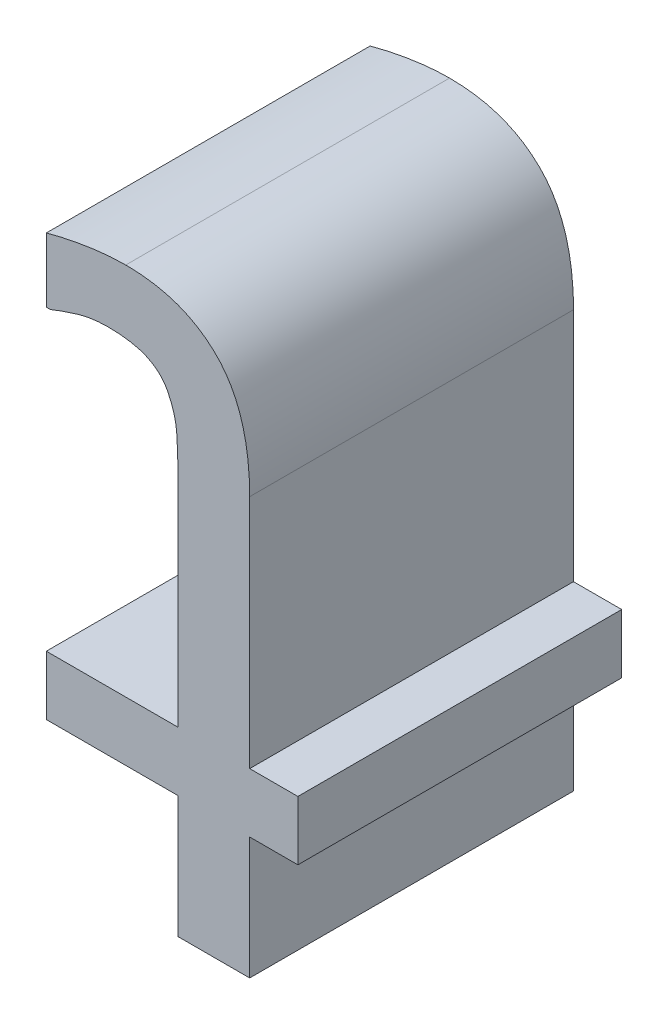
ISO-10303-21;
HEADER;
FILE_DESCRIPTION(('STEP AP214'),'2;1');
FILE_NAME('part.step','',(''),(''),'','','');
FILE_SCHEMA(('AUTOMOTIVE_DESIGN { 1 0 10303 214 1 1 1 1 }'));
ENDSEC;
DATA;
#1=APPLICATION_CONTEXT('core data for automotive mechanical design processes');
#2=APPLICATION_PROTOCOL_DEFINITION('international standard','automotive_design',2000,#1);
#3=PRODUCT_CONTEXT('',#1,'mechanical');
#4=PRODUCT('Part','Part','',(#3));
#5=PRODUCT_RELATED_PRODUCT_CATEGORY('part','',(#4));
#6=PRODUCT_DEFINITION_FORMATION('','',#4);
#7=PRODUCT_DEFINITION_CONTEXT('part definition',#1,'design');
#8=PRODUCT_DEFINITION('design','',#6,#7);
#9=PRODUCT_DEFINITION_SHAPE('','',#8);
#10=(LENGTH_UNIT() NAMED_UNIT(*) SI_UNIT(.MILLI.,.METRE.));
#11=(NAMED_UNIT(*) PLANE_ANGLE_UNIT() SI_UNIT($,.RADIAN.));
#12=(NAMED_UNIT(*) SI_UNIT($,.STERADIAN.) SOLID_ANGLE_UNIT());
#13=UNCERTAINTY_MEASURE_WITH_UNIT(LENGTH_MEASURE(1.E-05),#10,'distance_accuracy_value','');
#14=(GEOMETRIC_REPRESENTATION_CONTEXT(3) GLOBAL_UNCERTAINTY_ASSIGNED_CONTEXT((#13)) GLOBAL_UNIT_ASSIGNED_CONTEXT((#10,
#11,#12)) REPRESENTATION_CONTEXT('',''));
#15=CARTESIAN_POINT('',(0.,0.,0.));
#16=DIRECTION('',(0.,0.,1.));
#17=DIRECTION('',(1.,0.,0.));
#18=AXIS2_PLACEMENT_3D('',#15,#16,#17);
#19=CARTESIAN_POINT('',(5.8393187510365,1.5411365264468,0.));
#20=DIRECTION('',(1.,0.,0.));
#21=DIRECTION('',(0.,1.,0.));
#22=AXIS2_PLACEMENT_3D('',#19,#20,#21);
#23=PLANE('',#22);
#24=DIRECTION('',(0.,-1.,0.));
#25=VECTOR('',#24,1.);
#26=CARTESIAN_POINT('',(5.8393187510365,1.6138711172115,0.));
#27=LINE('',#26,#25);
#28=CARTESIAN_POINT('',(5.8393187510365,1.6138711172115,0.));
#29=VERTEX_POINT('',#28);
#30=CARTESIAN_POINT('',(5.8393187510365,1.5411365264468,0.));
#31=VERTEX_POINT('',#30);
#32=EDGE_CURVE('E11',#29,#31,#27,.T.);
#33=ORIENTED_EDGE('',*,*,#32,.F.);
#34=DIRECTION('',(0.,0.,1.));
#35=VECTOR('',#34,1.);
#36=CARTESIAN_POINT('',(5.8393187510365,1.6138711172115,0.));
#37=LINE('',#36,#35);
#38=CARTESIAN_POINT('',(5.8393187510365,1.6138711172115,0.1));
#39=VERTEX_POINT('',#38);
#40=EDGE_CURVE('E24',#29,#39,#37,.T.);
#41=ORIENTED_EDGE('',*,*,#40,.T.);
#42=DIRECTION('',(0.,1.,0.));
#43=VECTOR('',#42,1.);
#44=CARTESIAN_POINT('',(5.8393187510365,1.6138711172115,0.1));
#45=LINE('',#44,#43);
#46=CARTESIAN_POINT('',(5.8393187510365,1.5411365264468,0.1));
#47=VERTEX_POINT('',#46);
#48=EDGE_CURVE('E160',#47,#39,#45,.T.);
#49=ORIENTED_EDGE('',*,*,#48,.F.);
#50=DIRECTION('',(0.,0.,1.));
#51=VECTOR('',#50,1.);
#52=CARTESIAN_POINT('',(5.8393187510365,1.5411365264468,0.));
#53=LINE('',#52,#51);
#54=EDGE_CURVE('E331',#31,#47,#53,.T.);
#55=ORIENTED_EDGE('',*,*,#54,.F.);
#56=EDGE_LOOP('',(#33,#41,#49,#55));
#57=FACE_BOUND('',#56,.T.);
#58=ADVANCED_FACE('F17',(#57),#23,.T.);
#59=CARTESIAN_POINT('',(5.8542059479766,1.5411365264468,0.));
#60=DIRECTION('',(0.,1.,0.));
#61=DIRECTION('',(-1.,0.,0.));
#62=AXIS2_PLACEMENT_3D('',#59,#60,#61);
#63=PLANE('',#62);
#64=DIRECTION('',(1.,0.,0.));
#65=VECTOR('',#64,1.);
#66=CARTESIAN_POINT('',(5.8393187510365,1.5411365264468,0.));
#67=LINE('',#66,#65);
#68=CARTESIAN_POINT('',(5.8542059479766,1.5411365264468,0.));
#69=VERTEX_POINT('',#68);
#70=EDGE_CURVE('E329',#31,#69,#67,.T.);
#71=ORIENTED_EDGE('',*,*,#70,.F.);
#72=ORIENTED_EDGE('',*,*,#54,.T.);
#73=DIRECTION('',(-1.,0.,0.));
#74=VECTOR('',#73,1.);
#75=CARTESIAN_POINT('',(5.8393187510365,1.5411365264468,0.1));
#76=LINE('',#75,#74);
#77=CARTESIAN_POINT('',(5.8542059479766,1.5411365264468,0.1));
#78=VERTEX_POINT('',#77);
#79=EDGE_CURVE('E327',#78,#47,#76,.T.);
#80=ORIENTED_EDGE('',*,*,#79,.F.);
#81=DIRECTION('',(0.,0.,1.));
#82=VECTOR('',#81,1.);
#83=CARTESIAN_POINT('',(5.8542059479766,1.5411365264468,0.));
#84=LINE('',#83,#82);
#85=EDGE_CURVE('E324',#69,#78,#84,.T.);
#86=ORIENTED_EDGE('',*,*,#85,.F.);
#87=EDGE_LOOP('',(#71,#72,#80,#86));
#88=FACE_BOUND('',#87,.T.);
#89=ADVANCED_FACE('F393',(#88),#63,.T.);
#90=CARTESIAN_POINT('',(5.8542059479766,1.5228465416346,0.));
#91=DIRECTION('',(1.,0.,0.));
#92=DIRECTION('',(0.,1.,0.));
#93=AXIS2_PLACEMENT_3D('',#90,#91,#92);
#94=PLANE('',#93);
#95=DIRECTION('',(0.,-1.,0.));
#96=VECTOR('',#95,1.);
#97=CARTESIAN_POINT('',(5.8542059479766,1.5411365264468,0.));
#98=LINE('',#97,#96);
#99=CARTESIAN_POINT('',(5.8542059479766,1.5228465416346,0.));
#100=VERTEX_POINT('',#99);
#101=EDGE_CURVE('E322',#69,#100,#98,.T.);
#102=ORIENTED_EDGE('',*,*,#101,.F.);
#103=ORIENTED_EDGE('',*,*,#85,.T.);
#104=DIRECTION('',(0.,1.,0.));
#105=VECTOR('',#104,1.);
#106=CARTESIAN_POINT('',(5.8542059479766,1.5411365264468,0.1));
#107=LINE('',#106,#105);
#108=CARTESIAN_POINT('',(5.8542059479766,1.5228465416346,0.1));
#109=VERTEX_POINT('',#108);
#110=EDGE_CURVE('E319',#109,#78,#107,.T.);
#111=ORIENTED_EDGE('',*,*,#110,.F.);
#112=DIRECTION('',(0.,0.,1.));
#113=VECTOR('',#112,1.);
#114=CARTESIAN_POINT('',(5.8542059479766,1.5228465416346,0.));
#115=LINE('',#114,#113);
#116=EDGE_CURVE('E316',#100,#109,#115,.T.);
#117=ORIENTED_EDGE('',*,*,#116,.F.);
#118=EDGE_LOOP('',(#102,#103,#111,#117));
#119=FACE_BOUND('',#118,.T.);
#120=ADVANCED_FACE('F389',(#119),#94,.T.);
#121=CARTESIAN_POINT('',(5.8393187510365,1.5228465416346,0.));
#122=DIRECTION('',(0.,-1.,0.));
#123=DIRECTION('',(1.,0.,0.));
#124=AXIS2_PLACEMENT_3D('',#121,#122,#123);
#125=PLANE('',#124);
#126=DIRECTION('',(-1.,0.,0.));
#127=VECTOR('',#126,1.);
#128=CARTESIAN_POINT('',(5.8542059479766,1.5228465416346,0.));
#129=LINE('',#128,#127);
#130=CARTESIAN_POINT('',(5.8393187510365,1.5228465416346,0.));
#131=VERTEX_POINT('',#130);
#132=EDGE_CURVE('E314',#100,#131,#129,.T.);
#133=ORIENTED_EDGE('',*,*,#132,.F.);
#134=ORIENTED_EDGE('',*,*,#116,.T.);
#135=DIRECTION('',(1.,0.,0.));
#136=VECTOR('',#135,1.);
#137=CARTESIAN_POINT('',(5.8542059479766,1.5228465416346,0.1));
#138=LINE('',#137,#136);
#139=CARTESIAN_POINT('',(5.8393187510365,1.5228465416346,0.1));
#140=VERTEX_POINT('',#139);
#141=EDGE_CURVE('E311',#140,#109,#138,.T.);
#142=ORIENTED_EDGE('',*,*,#141,.F.);
#143=DIRECTION('',(0.,0.,1.));
#144=VECTOR('',#143,1.);
#145=CARTESIAN_POINT('',(5.8393187510365,1.5228465416346,0.));
#146=LINE('',#145,#144);
#147=EDGE_CURVE('E308',#131,#140,#146,.T.);
#148=ORIENTED_EDGE('',*,*,#147,.F.);
#149=EDGE_LOOP('',(#133,#134,#142,#148));
#150=FACE_BOUND('',#149,.T.);
#151=ADVANCED_FACE('F385',(#150),#125,.T.);
#152=CARTESIAN_POINT('',(5.8393187510365,1.4851323093862,0.));
#153=DIRECTION('',(1.,0.,0.));
#154=DIRECTION('',(0.,1.,0.));
#155=AXIS2_PLACEMENT_3D('',#152,#153,#154);
#156=PLANE('',#155);
#157=DIRECTION('',(0.,-1.,0.));
#158=VECTOR('',#157,1.);
#159=CARTESIAN_POINT('',(5.8393187510365,1.5228465416346,0.));
#160=LINE('',#159,#158);
#161=CARTESIAN_POINT('',(5.8393187510365,1.4851323093862,0.));
#162=VERTEX_POINT('',#161);
#163=EDGE_CURVE('E306',#131,#162,#160,.T.);
#164=ORIENTED_EDGE('',*,*,#163,.F.);
#165=ORIENTED_EDGE('',*,*,#147,.T.);
#166=DIRECTION('',(0.,1.,0.));
#167=VECTOR('',#166,1.);
#168=CARTESIAN_POINT('',(5.8393187510365,1.5228465416346,0.1));
#169=LINE('',#168,#167);
#170=CARTESIAN_POINT('',(5.8393187510365,1.4851323093862,0.1));
#171=VERTEX_POINT('',#170);
#172=EDGE_CURVE('E303',#171,#140,#169,.T.);
#173=ORIENTED_EDGE('',*,*,#172,.F.);
#174=DIRECTION('',(0.,0.,1.));
#175=VECTOR('',#174,1.);
#176=CARTESIAN_POINT('',(5.8393187510365,1.4851323093862,0.));
#177=LINE('',#176,#175);
#178=EDGE_CURVE('E300',#162,#171,#177,.T.);
#179=ORIENTED_EDGE('',*,*,#178,.F.);
#180=EDGE_LOOP('',(#164,#165,#173,#179));
#181=FACE_BOUND('',#180,.T.);
#182=ADVANCED_FACE('F381',(#181),#156,.T.);
#183=CARTESIAN_POINT('',(5.8172006298683,1.4851323093862,0.));
#184=DIRECTION('',(0.,-1.,0.));
#185=DIRECTION('',(1.,0.,0.));
#186=AXIS2_PLACEMENT_3D('',#183,#184,#185);
#187=PLANE('',#186);
#188=DIRECTION('',(-1.,0.,0.));
#189=VECTOR('',#188,1.);
#190=CARTESIAN_POINT('',(5.8393187510365,1.4851323093862,0.));
#191=LINE('',#190,#189);
#192=CARTESIAN_POINT('',(5.8172006298683,1.4851323093862,0.));
#193=VERTEX_POINT('',#192);
#194=EDGE_CURVE('E298',#162,#193,#191,.T.);
#195=ORIENTED_EDGE('',*,*,#194,.F.);
#196=ORIENTED_EDGE('',*,*,#178,.T.);
#197=DIRECTION('',(1.,0.,0.));
#198=VECTOR('',#197,1.);
#199=CARTESIAN_POINT('',(5.8393187510365,1.4851323093862,0.1));
#200=LINE('',#199,#198);
#201=CARTESIAN_POINT('',(5.8172006298683,1.4851323093862,0.1));
#202=VERTEX_POINT('',#201);
#203=EDGE_CURVE('E295',#202,#171,#200,.T.);
#204=ORIENTED_EDGE('',*,*,#203,.F.);
#205=DIRECTION('',(0.,0.,1.));
#206=VECTOR('',#205,1.);
#207=CARTESIAN_POINT('',(5.8172006298683,1.4851323093862,0.));
#208=LINE('',#207,#206);
#209=EDGE_CURVE('E292',#193,#202,#208,.T.);
#210=ORIENTED_EDGE('',*,*,#209,.F.);
#211=EDGE_LOOP('',(#195,#196,#204,#210));
#212=FACE_BOUND('',#211,.T.);
#213=ADVANCED_FACE('F377',(#212),#187,.T.);
#214=CARTESIAN_POINT('',(5.8172006298683,1.5228465416346,0.));
#215=DIRECTION('',(-1.,0.,0.));
#216=DIRECTION('',(0.,-1.,0.));
#217=AXIS2_PLACEMENT_3D('',#214,#215,#216);
#218=PLANE('',#217);
#219=DIRECTION('',(0.,1.,0.));
#220=VECTOR('',#219,1.);
#221=CARTESIAN_POINT('',(5.8172006298683,1.4851323093862,0.));
#222=LINE('',#221,#220);
#223=CARTESIAN_POINT('',(5.8172006298683,1.5228465416346,0.));
#224=VERTEX_POINT('',#223);
#225=EDGE_CURVE('E290',#193,#224,#222,.T.);
#226=ORIENTED_EDGE('',*,*,#225,.F.);
#227=ORIENTED_EDGE('',*,*,#209,.T.);
#228=DIRECTION('',(0.,-1.,0.));
#229=VECTOR('',#228,1.);
#230=CARTESIAN_POINT('',(5.8172006298683,1.4851323093862,0.1));
#231=LINE('',#230,#229);
#232=CARTESIAN_POINT('',(5.8172006298683,1.5228465416346,0.1));
#233=VERTEX_POINT('',#232);
#234=EDGE_CURVE('E287',#233,#202,#231,.T.);
#235=ORIENTED_EDGE('',*,*,#234,.F.);
#236=DIRECTION('',(0.,0.,1.));
#237=VECTOR('',#236,1.);
#238=CARTESIAN_POINT('',(5.8172006298683,1.5228465416346,0.));
#239=LINE('',#238,#237);
#240=EDGE_CURVE('E284',#224,#233,#239,.T.);
#241=ORIENTED_EDGE('',*,*,#240,.F.);
#242=EDGE_LOOP('',(#226,#227,#235,#241));
#243=FACE_BOUND('',#242,.T.);
#244=ADVANCED_FACE('F373',(#243),#218,.T.);
#245=CARTESIAN_POINT('',(5.7765089582319,1.5228465416346,0.));
#246=DIRECTION('',(0.,-1.,0.));
#247=DIRECTION('',(1.,0.,0.));
#248=AXIS2_PLACEMENT_3D('',#245,#246,#247);
#249=PLANE('',#248);
#250=DIRECTION('',(-1.,0.,0.));
#251=VECTOR('',#250,1.);
#252=CARTESIAN_POINT('',(5.8172006298683,1.5228465416346,0.));
#253=LINE('',#252,#251);
#254=CARTESIAN_POINT('',(5.7765089582319,1.5228465416346,0.));
#255=VERTEX_POINT('',#254);
#256=EDGE_CURVE('E282',#224,#255,#253,.T.);
#257=ORIENTED_EDGE('',*,*,#256,.F.);
#258=ORIENTED_EDGE('',*,*,#240,.T.);
#259=DIRECTION('',(1.,0.,0.));
#260=VECTOR('',#259,1.);
#261=CARTESIAN_POINT('',(5.8172006298683,1.5228465416346,0.1));
#262=LINE('',#261,#260);
#263=CARTESIAN_POINT('',(5.7765089582319,1.5228465416346,0.1));
#264=VERTEX_POINT('',#263);
#265=EDGE_CURVE('E279',#264,#233,#262,.T.);
#266=ORIENTED_EDGE('',*,*,#265,.F.);
#267=DIRECTION('',(0.,0.,1.));
#268=VECTOR('',#267,1.);
#269=CARTESIAN_POINT('',(5.7765089582319,1.5228465416346,0.));
#270=LINE('',#269,#268);
#271=EDGE_CURVE('E276',#255,#264,#270,.T.);
#272=ORIENTED_EDGE('',*,*,#271,.F.);
#273=EDGE_LOOP('',(#257,#258,#266,#272));
#274=FACE_BOUND('',#273,.T.);
#275=ADVANCED_FACE('F369',(#274),#249,.T.);
#276=CARTESIAN_POINT('',(5.7765089582319,1.5411365264468,0.));
#277=DIRECTION('',(-1.,0.,0.));
#278=DIRECTION('',(0.,-1.,0.));
#279=AXIS2_PLACEMENT_3D('',#276,#277,#278);
#280=PLANE('',#279);
#281=DIRECTION('',(0.,1.,0.));
#282=VECTOR('',#281,1.);
#283=CARTESIAN_POINT('',(5.7765089582319,1.5228465416346,0.));
#284=LINE('',#283,#282);
#285=CARTESIAN_POINT('',(5.7765089582319,1.5411365264468,0.));
#286=VERTEX_POINT('',#285);
#287=EDGE_CURVE('E274',#255,#286,#284,.T.);
#288=ORIENTED_EDGE('',*,*,#287,.F.);
#289=ORIENTED_EDGE('',*,*,#271,.T.);
#290=DIRECTION('',(0.,-1.,0.));
#291=VECTOR('',#290,1.);
#292=CARTESIAN_POINT('',(5.7765089582319,1.5228465416346,0.1));
#293=LINE('',#292,#291);
#294=CARTESIAN_POINT('',(5.7765089582319,1.5411365264468,0.1));
#295=VERTEX_POINT('',#294);
#296=EDGE_CURVE('E271',#295,#264,#293,.T.);
#297=ORIENTED_EDGE('',*,*,#296,.F.);
#298=DIRECTION('',(0.,0.,1.));
#299=VECTOR('',#298,1.);
#300=CARTESIAN_POINT('',(5.7765089582319,1.5411365264468,0.));
#301=LINE('',#300,#299);
#302=EDGE_CURVE('E268',#286,#295,#301,.T.);
#303=ORIENTED_EDGE('',*,*,#302,.F.);
#304=EDGE_LOOP('',(#288,#289,#297,#303));
#305=FACE_BOUND('',#304,.T.);
#306=ADVANCED_FACE('F365',(#305),#280,.T.);
#307=CARTESIAN_POINT('',(5.8172006298683,1.5411365264468,0.));
#308=DIRECTION('',(0.,1.,0.));
#309=DIRECTION('',(-1.,0.,0.));
#310=AXIS2_PLACEMENT_3D('',#307,#308,#309);
#311=PLANE('',#310);
#312=DIRECTION('',(1.,0.,0.));
#313=VECTOR('',#312,1.);
#314=CARTESIAN_POINT('',(5.7765089582319,1.5411365264468,0.));
#315=LINE('',#314,#313);
#316=CARTESIAN_POINT('',(5.8172006298683,1.5411365264468,0.));
#317=VERTEX_POINT('',#316);
#318=EDGE_CURVE('E266',#286,#317,#315,.T.);
#319=ORIENTED_EDGE('',*,*,#318,.F.);
#320=ORIENTED_EDGE('',*,*,#302,.T.);
#321=DIRECTION('',(-1.,0.,0.));
#322=VECTOR('',#321,1.);
#323=CARTESIAN_POINT('',(5.7765089582319,1.5411365264468,0.1));
#324=LINE('',#323,#322);
#325=CARTESIAN_POINT('',(5.8172006298683,1.5411365264468,0.1));
#326=VERTEX_POINT('',#325);
#327=EDGE_CURVE('E263',#326,#295,#324,.T.);
#328=ORIENTED_EDGE('',*,*,#327,.F.);
#329=DIRECTION('',(0.,0.,1.));
#330=VECTOR('',#329,1.);
#331=CARTESIAN_POINT('',(5.8172006298683,1.5411365264468,0.));
#332=LINE('',#331,#330);
#333=EDGE_CURVE('E260',#317,#326,#332,.T.);
#334=ORIENTED_EDGE('',*,*,#333,.F.);
#335=EDGE_LOOP('',(#319,#320,#328,#334));
#336=FACE_BOUND('',#335,.T.);
#337=ADVANCED_FACE('F361',(#336),#311,.T.);
#338=CARTESIAN_POINT('',(5.8172006298683,1.6036627535954,0.));
#339=DIRECTION('',(-1.,0.,0.));
#340=DIRECTION('',(0.,-1.,0.));
#341=AXIS2_PLACEMENT_3D('',#338,#339,#340);
#342=PLANE('',#341);
#343=DIRECTION('',(0.,1.,0.));
#344=VECTOR('',#343,1.);
#345=CARTESIAN_POINT('',(5.8172006298683,1.5411365264468,0.));
#346=LINE('',#345,#344);
#347=CARTESIAN_POINT('',(5.8172006298683,1.6036627535954,0.));
#348=VERTEX_POINT('',#347);
#349=EDGE_CURVE('E258',#317,#348,#346,.T.);
#350=ORIENTED_EDGE('',*,*,#349,.F.);
#351=ORIENTED_EDGE('',*,*,#333,.T.);
#352=DIRECTION('',(0.,-1.,0.));
#353=VECTOR('',#352,1.);
#354=CARTESIAN_POINT('',(5.8172006298683,1.5411365264468,0.1));
#355=LINE('',#354,#353);
#356=CARTESIAN_POINT('',(5.8172006298683,1.6036627535954,0.1));
#357=VERTEX_POINT('',#356);
#358=EDGE_CURVE('E255',#357,#326,#355,.T.);
#359=ORIENTED_EDGE('',*,*,#358,.F.);
#360=DIRECTION('',(0.,0.,1.));
#361=VECTOR('',#360,1.);
#362=CARTESIAN_POINT('',(5.8172006298683,1.6036627535954,0.));
#363=LINE('',#362,#361);
#364=EDGE_CURVE('E249',#348,#357,#363,.T.);
#365=ORIENTED_EDGE('',*,*,#364,.F.);
#366=EDGE_LOOP('',(#350,#351,#359,#365));
#367=FACE_BOUND('',#366,.T.);
#368=ADVANCED_FACE('F357',(#367),#342,.T.);
#369=CARTESIAN_POINT('',(5.8140814076522,1.6291836626356,0.));
#370=CARTESIAN_POINT('',(5.8140814076522,1.6291836626356,0.1));
#371=CARTESIAN_POINT('',(5.8164917157283,1.6245048293116,0.));
#372=CARTESIAN_POINT('',(5.8164917157283,1.6245048293116,0.1));
#373=CARTESIAN_POINT('',(5.8172006298683,1.6135875515555,0.));
#374=CARTESIAN_POINT('',(5.8172006298683,1.6135875515555,0.1));
#375=CARTESIAN_POINT('',(5.8172006298683,1.6036627535954,0.));
#376=CARTESIAN_POINT('',(5.8172006298683,1.6036627535954,0.1));
#377=B_SPLINE_SURFACE_WITH_KNOTS('',2,1,((#369,#370),(#371,#372),(#373,#374),(#375,#376)),
.UNSPECIFIED.,.F.,.F.,.F.,(3,1,3),(2,2),(-2.,-1.,0.),(0.,0.01),.UNSPECIFIED.);
#378=CARTESIAN_POINT('',(5.8172006298683,1.6036627535954,0.));
#379=CARTESIAN_POINT('',(5.8172006298683,1.6135875515555,0.));
#380=CARTESIAN_POINT('',(5.8164917157283,1.6245048293116,0.));
#381=CARTESIAN_POINT('',(5.8140814076522,1.6291836626356,0.));
#382=B_SPLINE_CURVE_WITH_KNOTS('',2,(#378,#379,#380,#381),.UNSPECIFIED.,.F.,.F.,(3,1,3),(0.,1.,
2.),.UNSPECIFIED.);
#383=CARTESIAN_POINT('',(5.8140814076522,1.6291836626356,0.));
#384=VERTEX_POINT('',#383);
#385=EDGE_CURVE('E242',#348,#384,#382,.T.);
#386=CARTESIAN_POINT('',(5.8140814076522,1.6291836626356,0.1));
#387=CARTESIAN_POINT('',(5.8164917157283,1.6245048293116,0.1));
#388=CARTESIAN_POINT('',(5.8172006298683,1.6135875515555,0.1));
#389=CARTESIAN_POINT('',(5.8172006298683,1.6036627535954,0.1));
#390=B_SPLINE_CURVE_WITH_KNOTS('',2,(#386,#387,#388,#389),.UNSPECIFIED.,.F.,.F.,(3,1,3),(-2.,
-1.,0.),.UNSPECIFIED.);
#391=CARTESIAN_POINT('',(5.8140814076522,1.6291836626356,0.1));
#392=VERTEX_POINT('',#391);
#393=EDGE_CURVE('E237',#392,#357,#390,.T.);
#394=DIRECTION('',(0.,0.,1.));
#395=VECTOR('',#394,1.);
#396=CARTESIAN_POINT('',(5.8140814076522,1.6291836626356,0.));
#397=LINE('',#396,#395);
#398=EDGE_CURVE('E231',#384,#392,#397,.T.);
#399=ORIENTED_EDGE('',*,*,#385,.F.);
#400=ORIENTED_EDGE('',*,*,#364,.T.);
#401=ORIENTED_EDGE('',*,*,#393,.F.);
#402=ORIENTED_EDGE('',*,*,#398,.F.);
#403=EDGE_LOOP('',(#399,#400,#401,#402));
#404=FACE_BOUND('',#403,.T.);
#405=ADVANCED_FACE('F353',(#404),#377,.T.);
#406=CARTESIAN_POINT('',(5.7955078571841,1.6374070666597,0.));
#407=CARTESIAN_POINT('',(5.7955078571841,1.6374070666597,0.1));
#408=CARTESIAN_POINT('',(5.8031641298961,1.6374070666597,0.));
#409=CARTESIAN_POINT('',(5.8031641298961,1.6374070666597,0.1));
#410=CARTESIAN_POINT('',(5.8120964480602,1.6332953646477,0.));
#411=CARTESIAN_POINT('',(5.8120964480602,1.6332953646477,0.1));
#412=CARTESIAN_POINT('',(5.8140814076522,1.6291836626356,0.));
#413=CARTESIAN_POINT('',(5.8140814076522,1.6291836626356,0.1));
#414=B_SPLINE_SURFACE_WITH_KNOTS('',2,1,((#406,#407),(#408,#409),(#410,#411),(#412,#413)),
.UNSPECIFIED.,.F.,.F.,.F.,(3,1,3),(2,2),(-2.,-1.,0.),(0.,0.01),.UNSPECIFIED.);
#415=CARTESIAN_POINT('',(5.8140814076522,1.6291836626356,0.));
#416=CARTESIAN_POINT('',(5.8120964480602,1.6332953646477,0.));
#417=CARTESIAN_POINT('',(5.8031641298961,1.6374070666597,0.));
#418=CARTESIAN_POINT('',(5.7955078571841,1.6374070666597,0.));
#419=B_SPLINE_CURVE_WITH_KNOTS('',2,(#415,#416,#417,#418),.UNSPECIFIED.,.F.,.F.,(3,1,3),(0.,1.,
2.),.UNSPECIFIED.);
#420=CARTESIAN_POINT('',(5.7955078571841,1.6374070666597,0.));
#421=VERTEX_POINT('',#420);
#422=EDGE_CURVE('E224',#384,#421,#419,.T.);
#423=CARTESIAN_POINT('',(5.7955078571841,1.6374070666597,0.1));
#424=CARTESIAN_POINT('',(5.8031641298961,1.6374070666597,0.1));
#425=CARTESIAN_POINT('',(5.8120964480602,1.6332953646477,0.1));
#426=CARTESIAN_POINT('',(5.8140814076522,1.6291836626356,0.1));
#427=B_SPLINE_CURVE_WITH_KNOTS('',2,(#423,#424,#425,#426),.UNSPECIFIED.,.F.,.F.,(3,1,3),(-2.,
-1.,0.),.UNSPECIFIED.);
#428=CARTESIAN_POINT('',(5.7955078571841,1.6374070666597,0.1));
#429=VERTEX_POINT('',#428);
#430=EDGE_CURVE('E219',#429,#392,#427,.T.);
#431=DIRECTION('',(0.,0.,1.));
#432=VECTOR('',#431,1.);
#433=CARTESIAN_POINT('',(5.7955078571841,1.6374070666597,0.));
#434=LINE('',#433,#432);
#435=EDGE_CURVE('E213',#421,#429,#434,.T.);
#436=ORIENTED_EDGE('',*,*,#422,.F.);
#437=ORIENTED_EDGE('',*,*,#398,.T.);
#438=ORIENTED_EDGE('',*,*,#430,.F.);
#439=ORIENTED_EDGE('',*,*,#435,.F.);
#440=EDGE_LOOP('',(#436,#437,#438,#439));
#441=FACE_BOUND('',#440,.T.);
#442=ADVANCED_FACE('F349',(#441),#414,.T.);
#443=CARTESIAN_POINT('',(5.7777850036839,1.6331535818197,0.));
#444=CARTESIAN_POINT('',(5.7777850036839,1.6331535818197,0.1));
#445=CARTESIAN_POINT('',(5.7800535289319,1.6341460616157,0.));
#446=CARTESIAN_POINT('',(5.7800535289319,1.6341460616157,0.1));
#447=CARTESIAN_POINT('',(5.79012010972,1.6374070666597,0.));
#448=CARTESIAN_POINT('',(5.79012010972,1.6374070666597,0.1));
#449=CARTESIAN_POINT('',(5.7955078571841,1.6374070666597,0.));
#450=CARTESIAN_POINT('',(5.7955078571841,1.6374070666597,0.1));
#451=B_SPLINE_SURFACE_WITH_KNOTS('',2,1,((#443,#444),(#445,#446),(#447,#448),(#449,#450)),
.UNSPECIFIED.,.F.,.F.,.F.,(3,1,3),(2,2),(-2.,-1.,0.),(0.,0.01),.UNSPECIFIED.);
#452=CARTESIAN_POINT('',(5.7955078571841,1.6374070666597,0.));
#453=CARTESIAN_POINT('',(5.79012010972,1.6374070666597,0.));
#454=CARTESIAN_POINT('',(5.7800535289319,1.6341460616157,0.));
#455=CARTESIAN_POINT('',(5.7777850036839,1.6331535818197,0.));
#456=B_SPLINE_CURVE_WITH_KNOTS('',2,(#452,#453,#454,#455),.UNSPECIFIED.,.F.,.F.,(3,1,3),(0.,1.,
2.),.UNSPECIFIED.);
#457=CARTESIAN_POINT('',(5.7777850036839,1.6331535818197,0.));
#458=VERTEX_POINT('',#457);
#459=EDGE_CURVE('E206',#421,#458,#456,.T.);
#460=CARTESIAN_POINT('',(5.7777850036839,1.6331535818197,0.1));
#461=CARTESIAN_POINT('',(5.7800535289319,1.6341460616157,0.1));
#462=CARTESIAN_POINT('',(5.79012010972,1.6374070666597,0.1));
#463=CARTESIAN_POINT('',(5.7955078571841,1.6374070666597,0.1));
#464=B_SPLINE_CURVE_WITH_KNOTS('',2,(#460,#461,#462,#463),.UNSPECIFIED.,.F.,.F.,(3,1,3),(-2.,
-1.,0.),.UNSPECIFIED.);
#465=CARTESIAN_POINT('',(5.7777850036839,1.6331535818197,0.1));
#466=VERTEX_POINT('',#465);
#467=EDGE_CURVE('E201',#466,#429,#464,.T.);
#468=DIRECTION('',(0.,0.,1.));
#469=VECTOR('',#468,1.);
#470=CARTESIAN_POINT('',(5.7777850036839,1.6331535818197,0.));
#471=LINE('',#470,#469);
#472=EDGE_CURVE('E198',#458,#466,#471,.T.);
#473=ORIENTED_EDGE('',*,*,#459,.F.);
#474=ORIENTED_EDGE('',*,*,#435,.T.);
#475=ORIENTED_EDGE('',*,*,#467,.F.);
#476=ORIENTED_EDGE('',*,*,#472,.F.);
#477=EDGE_LOOP('',(#473,#474,#475,#476));
#478=FACE_BOUND('',#477,.T.);
#479=ADVANCED_FACE('F345',(#478),#451,.T.);
#480=CARTESIAN_POINT('',(5.7765089582319,1.6331535818197,0.));
#481=DIRECTION('',(0.,-1.,0.));
#482=DIRECTION('',(1.,0.,0.));
#483=AXIS2_PLACEMENT_3D('',#480,#481,#482);
#484=PLANE('',#483);
#485=DIRECTION('',(-1.,0.,0.));
#486=VECTOR('',#485,1.);
#487=CARTESIAN_POINT('',(5.7777850036839,1.6331535818197,0.));
#488=LINE('',#487,#486);
#489=CARTESIAN_POINT('',(5.7765089582319,1.6331535818197,0.));
#490=VERTEX_POINT('',#489);
#491=EDGE_CURVE('E196',#458,#490,#488,.T.);
#492=ORIENTED_EDGE('',*,*,#491,.F.);
#493=ORIENTED_EDGE('',*,*,#472,.T.);
#494=DIRECTION('',(1.,0.,0.));
#495=VECTOR('',#494,1.);
#496=CARTESIAN_POINT('',(5.7777850036839,1.6331535818197,0.1));
#497=LINE('',#496,#495);
#498=CARTESIAN_POINT('',(5.7765089582319,1.6331535818197,0.1));
#499=VERTEX_POINT('',#498);
#500=EDGE_CURVE('E193',#499,#466,#497,.T.);
#501=ORIENTED_EDGE('',*,*,#500,.F.);
#502=DIRECTION('',(0.,0.,1.));
#503=VECTOR('',#502,1.);
#504=CARTESIAN_POINT('',(5.7765089582319,1.6331535818197,0.));
#505=LINE('',#504,#503);
#506=EDGE_CURVE('E190',#490,#499,#505,.T.);
#507=ORIENTED_EDGE('',*,*,#506,.F.);
#508=EDGE_LOOP('',(#492,#493,#501,#507));
#509=FACE_BOUND('',#508,.T.);
#510=ADVANCED_FACE('F341',(#509),#484,.T.);
#511=CARTESIAN_POINT('',(5.7765089582319,1.6530031777399,0.));
#512=DIRECTION('',(-1.,0.,0.));
#513=DIRECTION('',(0.,-1.,0.));
#514=AXIS2_PLACEMENT_3D('',#511,#512,#513);
#515=PLANE('',#514);
#516=DIRECTION('',(0.,1.,0.));
#517=VECTOR('',#516,1.);
#518=CARTESIAN_POINT('',(5.7765089582319,1.6331535818197,0.));
#519=LINE('',#518,#517);
#520=CARTESIAN_POINT('',(5.7765089582319,1.6530031777399,0.));
#521=VERTEX_POINT('',#520);
#522=EDGE_CURVE('E188',#490,#521,#519,.T.);
#523=ORIENTED_EDGE('',*,*,#522,.F.);
#524=ORIENTED_EDGE('',*,*,#506,.T.);
#525=DIRECTION('',(0.,-1.,0.));
#526=VECTOR('',#525,1.);
#527=CARTESIAN_POINT('',(5.7765089582319,1.6331535818197,0.1));
#528=LINE('',#527,#526);
#529=CARTESIAN_POINT('',(5.7765089582319,1.6530031777399,0.1));
#530=VERTEX_POINT('',#529);
#531=EDGE_CURVE('E186',#530,#499,#528,.T.);
#532=ORIENTED_EDGE('',*,*,#531,.F.);
#533=DIRECTION('',(0.,0.,1.));
#534=VECTOR('',#533,1.);
#535=CARTESIAN_POINT('',(5.7765089582319,1.6530031777399,0.));
#536=LINE('',#535,#534);
#537=EDGE_CURVE('E145',#521,#530,#536,.T.);
#538=ORIENTED_EDGE('',*,*,#537,.F.);
#539=EDGE_LOOP('',(#523,#524,#532,#538));
#540=FACE_BOUND('',#539,.T.);
#541=ADVANCED_FACE('F339',(#540),#515,.T.);
#542=CARTESIAN_POINT('',(5.8010373874761,1.6566895312679,0.));
#543=CARTESIAN_POINT('',(5.8010373874761,1.6566895312679,0.1));
#544=CARTESIAN_POINT('',(5.7955078571841,1.6566895312679,0.));
#545=CARTESIAN_POINT('',(5.7955078571841,1.6566895312679,0.1));
#546=CARTESIAN_POINT('',(5.7827474026639,1.6547045716759,0.));
#547=CARTESIAN_POINT('',(5.7827474026639,1.6547045716759,0.1));
#548=CARTESIAN_POINT('',(5.7765089582319,1.6530031777399,0.));
#549=CARTESIAN_POINT('',(5.7765089582319,1.6530031777399,0.1));
#550=B_SPLINE_SURFACE_WITH_KNOTS('',2,1,((#542,#543),(#544,#545),(#546,#547),(#548,#549)),
.UNSPECIFIED.,.F.,.F.,.F.,(3,1,3),(2,2),(-2.,-1.,0.),(0.,0.01),.UNSPECIFIED.);
#551=CARTESIAN_POINT('',(5.7765089582319,1.6530031777399,0.));
#552=CARTESIAN_POINT('',(5.7827474026639,1.6547045716759,0.));
#553=CARTESIAN_POINT('',(5.7955078571841,1.6566895312679,0.));
#554=CARTESIAN_POINT('',(5.8010373874761,1.6566895312679,0.));
#555=B_SPLINE_CURVE_WITH_KNOTS('',2,(#551,#552,#553,#554),.UNSPECIFIED.,.F.,.F.,(3,1,3),(0.,1.,
2.),.UNSPECIFIED.);
#556=CARTESIAN_POINT('',(5.8010373874761,1.6566895312679,0.));
#557=VERTEX_POINT('',#556);
#558=EDGE_CURVE('E149',#521,#557,#555,.T.);
#559=CARTESIAN_POINT('',(5.8010373874761,1.6566895312679,0.1));
#560=CARTESIAN_POINT('',(5.7955078571841,1.6566895312679,0.1));
#561=CARTESIAN_POINT('',(5.7827474026639,1.6547045716759,0.1));
#562=CARTESIAN_POINT('',(5.7765089582319,1.6530031777399,0.1));
#563=B_SPLINE_CURVE_WITH_KNOTS('',2,(#559,#560,#561,#562),.UNSPECIFIED.,.F.,.F.,(3,1,3),(-2.,
-1.,0.),.UNSPECIFIED.);
#564=CARTESIAN_POINT('',(5.8010373874761,1.6566895312679,0.1));
#565=VERTEX_POINT('',#564);
#566=EDGE_CURVE('E138',#565,#530,#563,.T.);
#567=DIRECTION('',(0.,0.,1.));
#568=VECTOR('',#567,1.);
#569=CARTESIAN_POINT('',(5.8010373874761,1.6566895312679,0.));
#570=LINE('',#569,#568);
#571=EDGE_CURVE('E142',#557,#565,#570,.T.);
#572=ORIENTED_EDGE('',*,*,#558,.F.);
#573=ORIENTED_EDGE('',*,*,#537,.T.);
#574=ORIENTED_EDGE('',*,*,#566,.F.);
#575=ORIENTED_EDGE('',*,*,#571,.F.);
#576=EDGE_LOOP('',(#572,#573,#574,#575));
#577=FACE_BOUND('',#576,.T.);
#578=ADVANCED_FACE('F141',(#577),#550,.T.);
#579=CARTESIAN_POINT('',(5.8393187510365,1.6138711172115,0.));
#580=CARTESIAN_POINT('',(5.8393187510365,1.6138711172115,0.1));
#581=CARTESIAN_POINT('',(5.8393187510365,1.6361310212077,0.));
#582=CARTESIAN_POINT('',(5.8393187510365,1.6361310212077,0.1));
#583=CARTESIAN_POINT('',(5.8190438066323,1.6566895312679,0.));
#584=CARTESIAN_POINT('',(5.8190438066323,1.6566895312679,0.1));
#585=CARTESIAN_POINT('',(5.8010373874761,1.6566895312679,0.));
#586=CARTESIAN_POINT('',(5.8010373874761,1.6566895312679,0.1));
#587=B_SPLINE_SURFACE_WITH_KNOTS('',2,1,((#579,#580),(#581,#582),(#583,#584),(#585,#586)),
.UNSPECIFIED.,.F.,.F.,.F.,(3,1,3),(2,2),(-2.,-1.,0.),(0.,0.01),.UNSPECIFIED.);
#588=CARTESIAN_POINT('',(5.8010373874761,1.6566895312679,0.));
#589=CARTESIAN_POINT('',(5.8190438066323,1.6566895312679,0.));
#590=CARTESIAN_POINT('',(5.8393187510365,1.6361310212077,0.));
#591=CARTESIAN_POINT('',(5.8393187510365,1.6138711172115,0.));
#592=B_SPLINE_CURVE_WITH_KNOTS('',2,(#588,#589,#590,#591),.UNSPECIFIED.,.F.,.F.,(3,1,3),(0.,1.,
2.),.UNSPECIFIED.);
#593=EDGE_CURVE('E155',#557,#29,#592,.T.);
#594=CARTESIAN_POINT('',(5.8393187510365,1.6138711172115,0.1));
#595=CARTESIAN_POINT('',(5.8393187510365,1.6361310212077,0.1));
#596=CARTESIAN_POINT('',(5.8190438066323,1.6566895312679,0.1));
#597=CARTESIAN_POINT('',(5.8010373874761,1.6566895312679,0.1));
#598=B_SPLINE_CURVE_WITH_KNOTS('',2,(#594,#595,#596,#597),.UNSPECIFIED.,.F.,.F.,(3,1,3),(-2.,
-1.,0.),.UNSPECIFIED.);
#599=EDGE_CURVE('E154',#39,#565,#598,.T.);
#600=ORIENTED_EDGE('',*,*,#593,.F.);
#601=ORIENTED_EDGE('',*,*,#571,.T.);
#602=ORIENTED_EDGE('',*,*,#599,.F.);
#603=ORIENTED_EDGE('',*,*,#40,.F.);
#604=EDGE_LOOP('',(#600,#601,#602,#603));
#605=FACE_BOUND('',#604,.T.);
#606=ADVANCED_FACE('F153',(#605),#587,.T.);
#607=CARTESIAN_POINT('',(5.8177858908387,1.5656342325293,0.));
#608=DIRECTION('',(0.,0.,1.));
#609=DIRECTION('',(1.,0.,0.));
#610=AXIS2_PLACEMENT_3D('',#607,#608,#609);
#611=PLANE('',#610);
#612=ORIENTED_EDGE('',*,*,#593,.T.);
#613=ORIENTED_EDGE('',*,*,#32,.T.);
#614=ORIENTED_EDGE('',*,*,#70,.T.);
#615=ORIENTED_EDGE('',*,*,#101,.T.);
#616=ORIENTED_EDGE('',*,*,#132,.T.);
#617=ORIENTED_EDGE('',*,*,#163,.T.);
#618=ORIENTED_EDGE('',*,*,#194,.T.);
#619=ORIENTED_EDGE('',*,*,#225,.T.);
#620=ORIENTED_EDGE('',*,*,#256,.T.);
#621=ORIENTED_EDGE('',*,*,#287,.T.);
#622=ORIENTED_EDGE('',*,*,#318,.T.);
#623=ORIENTED_EDGE('',*,*,#349,.T.);
#624=ORIENTED_EDGE('',*,*,#385,.T.);
#625=ORIENTED_EDGE('',*,*,#422,.T.);
#626=ORIENTED_EDGE('',*,*,#459,.T.);
#627=ORIENTED_EDGE('',*,*,#491,.T.);
#628=ORIENTED_EDGE('',*,*,#522,.T.);
#629=ORIENTED_EDGE('',*,*,#558,.T.);
#630=EDGE_LOOP('',(#612,#613,#614,#615,#616,#617,#618,#619,#620,#621,#622,#623,#624,#625,#626,
#627,#628,#629));
#631=FACE_BOUND('',#630,.T.);
#632=ADVANCED_FACE('F334',(#631),#611,.F.);
#633=CARTESIAN_POINT('',(5.8177858908387,1.5656342325293,0.1));
#634=DIRECTION('',(0.,0.,1.));
#635=DIRECTION('',(1.,0.,0.));
#636=AXIS2_PLACEMENT_3D('',#633,#634,#635);
#637=PLANE('',#636);
#638=ORIENTED_EDGE('',*,*,#599,.T.);
#639=ORIENTED_EDGE('',*,*,#566,.T.);
#640=ORIENTED_EDGE('',*,*,#531,.T.);
#641=ORIENTED_EDGE('',*,*,#500,.T.);
#642=ORIENTED_EDGE('',*,*,#467,.T.);
#643=ORIENTED_EDGE('',*,*,#430,.T.);
#644=ORIENTED_EDGE('',*,*,#393,.T.);
#645=ORIENTED_EDGE('',*,*,#358,.T.);
#646=ORIENTED_EDGE('',*,*,#327,.T.);
#647=ORIENTED_EDGE('',*,*,#296,.T.);
#648=ORIENTED_EDGE('',*,*,#265,.T.);
#649=ORIENTED_EDGE('',*,*,#234,.T.);
#650=ORIENTED_EDGE('',*,*,#203,.T.);
#651=ORIENTED_EDGE('',*,*,#172,.T.);
#652=ORIENTED_EDGE('',*,*,#141,.T.);
#653=ORIENTED_EDGE('',*,*,#110,.T.);
#654=ORIENTED_EDGE('',*,*,#79,.T.);
#655=ORIENTED_EDGE('',*,*,#48,.T.);
#656=EDGE_LOOP('',(#638,#639,#640,#641,#642,#643,#644,#645,#646,#647,#648,#649,#650,#651,#652,
#653,#654,#655));
#657=FACE_BOUND('',#656,.T.);
#658=ADVANCED_FACE('F158',(#657),#637,.T.);
#659=CLOSED_SHELL('',(#58,#89,#120,#151,#182,#213,#244,#275,#306,#337,#368,#405,#442,#479,#510,
#541,#578,#606,#632,#658));
#660=MANIFOLD_SOLID_BREP('B1',#659);
#661=ADVANCED_BREP_SHAPE_REPRESENTATION('',(#18,#660),#14);
#662=SHAPE_DEFINITION_REPRESENTATION(#9,#661);
ENDSEC;
END-ISO-10303-21;
